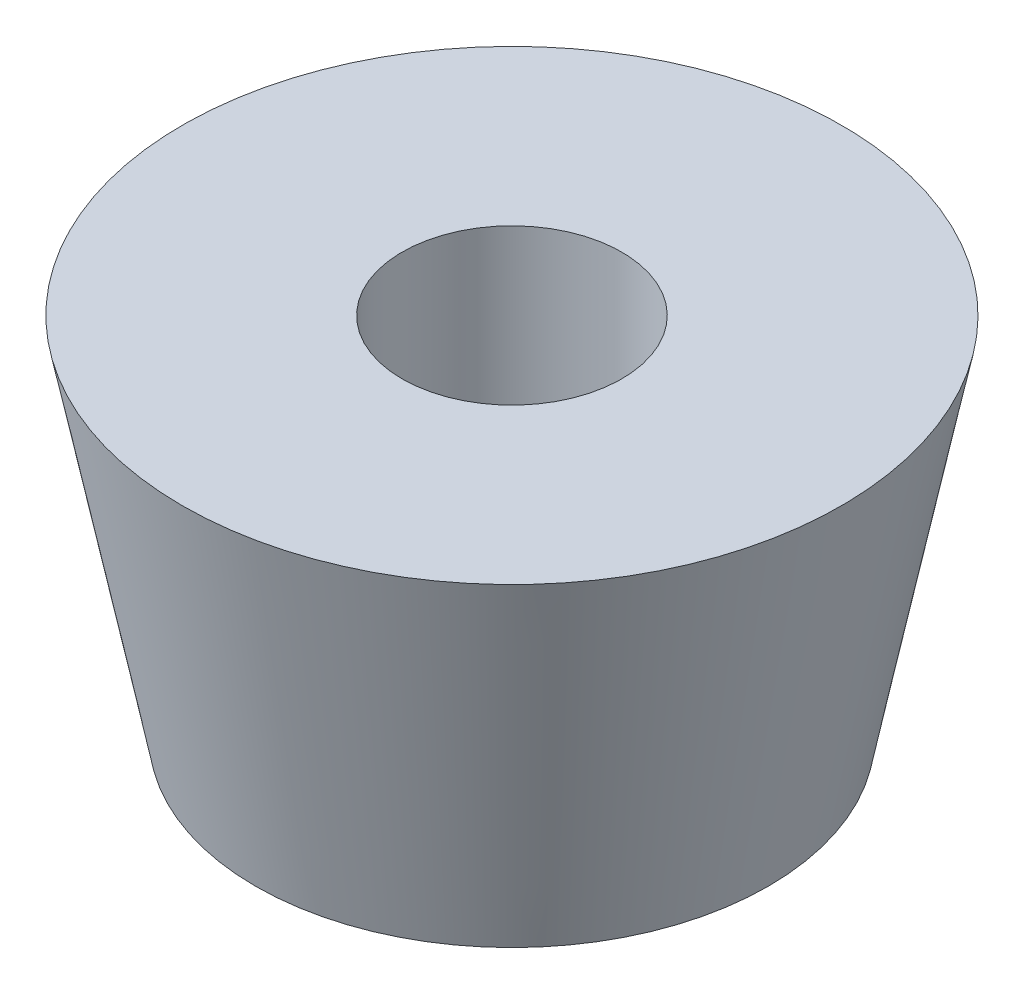
ISO-10303-21;
HEADER;
FILE_DESCRIPTION(('STEP AP214'),'2;1');
FILE_NAME('part.step','',(''),(''),'','','');
FILE_SCHEMA(('AUTOMOTIVE_DESIGN { 1 0 10303 214 1 1 1 1 }'));
ENDSEC;
DATA;
#1=APPLICATION_CONTEXT('core data for automotive mechanical design processes');
#2=APPLICATION_PROTOCOL_DEFINITION('international standard','automotive_design',2000,#1);
#3=PRODUCT_CONTEXT('',#1,'mechanical');
#4=PRODUCT('Part','Part','',(#3));
#5=PRODUCT_RELATED_PRODUCT_CATEGORY('part','',(#4));
#6=PRODUCT_DEFINITION_FORMATION('','',#4);
#7=PRODUCT_DEFINITION_CONTEXT('part definition',#1,'design');
#8=PRODUCT_DEFINITION('design','',#6,#7);
#9=PRODUCT_DEFINITION_SHAPE('','',#8);
#10=(LENGTH_UNIT() NAMED_UNIT(*) SI_UNIT(.MILLI.,.METRE.));
#11=(NAMED_UNIT(*) PLANE_ANGLE_UNIT() SI_UNIT($,.RADIAN.));
#12=(NAMED_UNIT(*) SI_UNIT($,.STERADIAN.) SOLID_ANGLE_UNIT());
#13=UNCERTAINTY_MEASURE_WITH_UNIT(LENGTH_MEASURE(1.E-05),#10,'distance_accuracy_value','');
#14=(GEOMETRIC_REPRESENTATION_CONTEXT(3) GLOBAL_UNCERTAINTY_ASSIGNED_CONTEXT((#13)) GLOBAL_UNIT_ASSIGNED_CONTEXT((#10,
#11,#12)) REPRESENTATION_CONTEXT('',''));
#15=CARTESIAN_POINT('',(0.,0.,0.));
#16=DIRECTION('',(0.,0.,1.));
#17=DIRECTION('',(1.,0.,0.));
#18=AXIS2_PLACEMENT_3D('',#15,#16,#17);
#19=CARTESIAN_POINT('',(0.,0.,-4.5));
#20=DIRECTION('',(0.,-1.,0.));
#21=DIRECTION('',(0.,0.,-1.));
#22=AXIS2_PLACEMENT_3D('',#19,#20,#21);
#23=PLANE('',#22);
#24=CARTESIAN_POINT('',(0.,0.,0.));
#25=DIRECTION('',(0.,1.,0.));
#26=DIRECTION('',(0.,0.,1.));
#27=AXIS2_PLACEMENT_3D('',#24,#25,#26);
#28=CIRCLE('',#27,1.5);
#29=CARTESIAN_POINT('',(0.,0.,1.5));
#30=VERTEX_POINT('',#29);
#31=EDGE_CURVE('E10',#30,#30,#28,.T.);
#32=ORIENTED_EDGE('',*,*,#31,.F.);
#33=EDGE_LOOP('',(#32));
#34=FACE_BOUND('',#33,.T.);
#35=CARTESIAN_POINT('',(0.,0.,0.));
#36=DIRECTION('',(0.,1.,0.));
#37=DIRECTION('',(0.,0.,1.));
#38=AXIS2_PLACEMENT_3D('',#35,#36,#37);
#39=CIRCLE('',#38,4.5);
#40=CARTESIAN_POINT('',(0.,0.,4.5));
#41=VERTEX_POINT('',#40);
#42=EDGE_CURVE('E56',#41,#41,#39,.T.);
#43=ORIENTED_EDGE('',*,*,#42,.T.);
#44=EDGE_LOOP('',(#43));
#45=FACE_BOUND('',#44,.T.);
#46=ADVANCED_FACE('F39',(#34,#45),#23,.F.);
#47=CARTESIAN_POINT('',(0.,0.,0.));
#48=DIRECTION('',(0.,1.,0.));
#49=DIRECTION('',(0.,0.,1.));
#50=AXIS2_PLACEMENT_3D('',#47,#48,#49);
#51=CYLINDRICAL_SURFACE('',#50,1.5);
#52=CARTESIAN_POINT('',(0.,-5.,0.));
#53=DIRECTION('',(0.,1.,0.));
#54=DIRECTION('',(0.,0.,1.));
#55=AXIS2_PLACEMENT_3D('',#52,#53,#54);
#56=CIRCLE('',#55,1.5);
#57=CARTESIAN_POINT('',(0.,-5.,1.5));
#58=VERTEX_POINT('',#57);
#59=EDGE_CURVE('E46',#58,#58,#56,.T.);
#60=ORIENTED_EDGE('',*,*,#59,.F.);
#61=EDGE_LOOP('',(#60));
#62=FACE_BOUND('',#61,.T.);
#63=ORIENTED_EDGE('',*,*,#31,.T.);
#64=EDGE_LOOP('',(#63));
#65=FACE_BOUND('',#64,.T.);
#66=ADVANCED_FACE('F72',(#62,#65),#51,.F.);
#67=CARTESIAN_POINT('',(0.,-5.,-1.5));
#68=DIRECTION('',(0.,1.,0.));
#69=DIRECTION('',(0.,0.,1.));
#70=AXIS2_PLACEMENT_3D('',#67,#68,#69);
#71=PLANE('',#70);
#72=CARTESIAN_POINT('',(0.,-5.,0.));
#73=DIRECTION('',(0.,1.,0.));
#74=DIRECTION('',(0.,0.,1.));
#75=AXIS2_PLACEMENT_3D('',#72,#73,#74);
#76=CIRCLE('',#75,3.5);
#77=CARTESIAN_POINT('',(0.,-5.,3.5));
#78=VERTEX_POINT('',#77);
#79=EDGE_CURVE('E51',#78,#78,#76,.T.);
#80=ORIENTED_EDGE('',*,*,#79,.F.);
#81=EDGE_LOOP('',(#80));
#82=FACE_BOUND('',#81,.T.);
#83=ORIENTED_EDGE('',*,*,#59,.T.);
#84=EDGE_LOOP('',(#83));
#85=FACE_BOUND('',#84,.T.);
#86=ADVANCED_FACE('F67',(#82,#85),#71,.F.);
#87=CARTESIAN_POINT('',(0.,-5.,0.));
#88=DIRECTION('',(0.,1.,0.));
#89=DIRECTION('',(0.,0.,1.));
#90=AXIS2_PLACEMENT_3D('',#87,#88,#89);
#91=CONICAL_SURFACE('',#90,3.5,0.197395559849881);
#92=ORIENTED_EDGE('',*,*,#42,.F.);
#93=EDGE_LOOP('',(#92));
#94=FACE_BOUND('',#93,.T.);
#95=ORIENTED_EDGE('',*,*,#79,.T.);
#96=EDGE_LOOP('',(#95));
#97=FACE_BOUND('',#96,.T.);
#98=ADVANCED_FACE('F64',(#94,#97),#91,.T.);
#99=CLOSED_SHELL('',(#46,#66,#86,#98));
#100=MANIFOLD_SOLID_BREP('B2',#99);
#101=ADVANCED_BREP_SHAPE_REPRESENTATION('',(#18,#100),#14);
#102=SHAPE_DEFINITION_REPRESENTATION(#9,#101);
ENDSEC;
END-ISO-10303-21;
